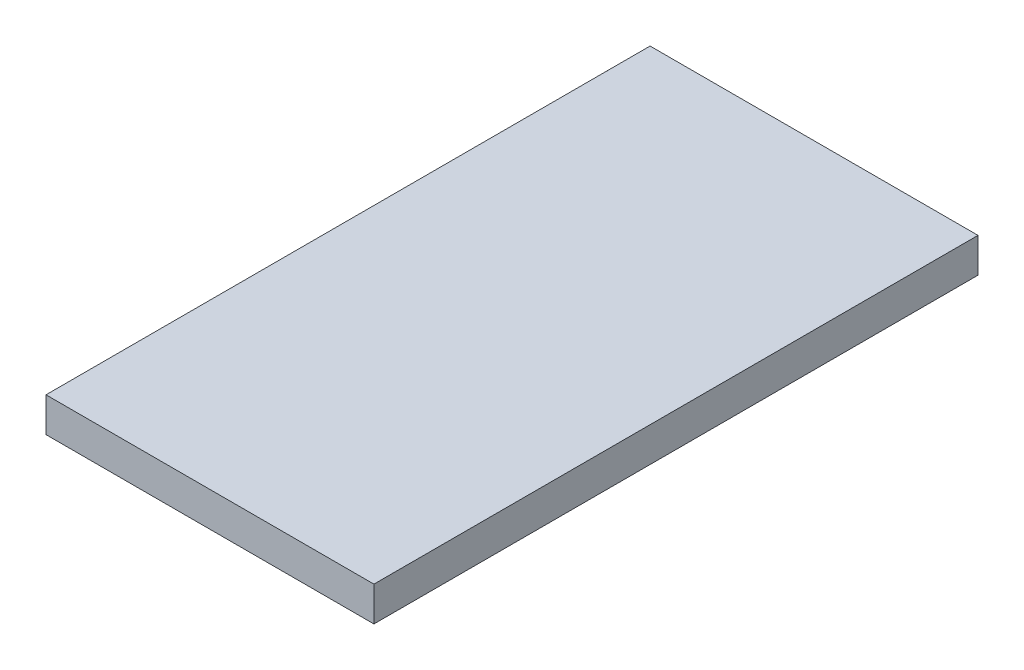
ISO-10303-21;
HEADER;
FILE_DESCRIPTION(('STEP AP214'),'2;1');
FILE_NAME('part.step','',(''),(''),'','','');
FILE_SCHEMA(('AUTOMOTIVE_DESIGN { 1 0 10303 214 1 1 1 1 }'));
ENDSEC;
DATA;
#1=APPLICATION_CONTEXT('core data for automotive mechanical design processes');
#2=APPLICATION_PROTOCOL_DEFINITION('international standard','automotive_design',2000,#1);
#3=PRODUCT_CONTEXT('',#1,'mechanical');
#4=PRODUCT('Part','Part','',(#3));
#5=PRODUCT_RELATED_PRODUCT_CATEGORY('part','',(#4));
#6=PRODUCT_DEFINITION_FORMATION('','',#4);
#7=PRODUCT_DEFINITION_CONTEXT('part definition',#1,'design');
#8=PRODUCT_DEFINITION('design','',#6,#7);
#9=PRODUCT_DEFINITION_SHAPE('','',#8);
#10=(LENGTH_UNIT() NAMED_UNIT(*) SI_UNIT(.MILLI.,.METRE.));
#11=(NAMED_UNIT(*) PLANE_ANGLE_UNIT() SI_UNIT($,.RADIAN.));
#12=(NAMED_UNIT(*) SI_UNIT($,.STERADIAN.) SOLID_ANGLE_UNIT());
#13=UNCERTAINTY_MEASURE_WITH_UNIT(LENGTH_MEASURE(1.E-05),#10,'distance_accuracy_value','');
#14=(GEOMETRIC_REPRESENTATION_CONTEXT(3) GLOBAL_UNCERTAINTY_ASSIGNED_CONTEXT((#13)) GLOBAL_UNIT_ASSIGNED_CONTEXT((#10,
#11,#12)) REPRESENTATION_CONTEXT('',''));
#15=CARTESIAN_POINT('',(0.,0.,0.));
#16=DIRECTION('',(0.,0.,1.));
#17=DIRECTION('',(1.,0.,0.));
#18=AXIS2_PLACEMENT_3D('',#15,#16,#17);
#19=CARTESIAN_POINT('',(0.,2.,17.5));
#20=DIRECTION('',(0.,0.,-1.));
#21=DIRECTION('',(-1.,0.,0.));
#22=AXIS2_PLACEMENT_3D('',#19,#20,#21);
#23=PLANE('',#22);
#24=DIRECTION('',(1.,0.,0.));
#25=VECTOR('',#24,1.);
#26=CARTESIAN_POINT('',(0.,0.,17.5));
#27=LINE('',#26,#25);
#28=CARTESIAN_POINT('',(-9.5,0.,17.5));
#29=VERTEX_POINT('',#28);
#30=CARTESIAN_POINT('',(9.5,0.,17.5));
#31=VERTEX_POINT('',#30);
#32=EDGE_CURVE('E102',#29,#31,#27,.T.);
#33=ORIENTED_EDGE('',*,*,#32,.T.);
#34=DIRECTION('',(0.,-1.,0.));
#35=VECTOR('',#34,1.);
#36=CARTESIAN_POINT('',(9.5,2.,17.5));
#37=LINE('',#36,#35);
#38=CARTESIAN_POINT('',(9.5,2.,17.5));
#39=VERTEX_POINT('',#38);
#40=EDGE_CURVE('E11',#39,#31,#37,.T.);
#41=ORIENTED_EDGE('',*,*,#40,.F.);
#42=DIRECTION('',(1.,0.,0.));
#43=VECTOR('',#42,1.);
#44=CARTESIAN_POINT('',(0.,2.,17.5));
#45=LINE('',#44,#43);
#46=CARTESIAN_POINT('',(-9.5,2.,17.5));
#47=VERTEX_POINT('',#46);
#48=EDGE_CURVE('E88',#47,#39,#45,.T.);
#49=ORIENTED_EDGE('',*,*,#48,.F.);
#50=DIRECTION('',(0.,-1.,0.));
#51=VECTOR('',#50,1.);
#52=CARTESIAN_POINT('',(-9.5,2.,17.5));
#53=LINE('',#52,#51);
#54=EDGE_CURVE('E55',#47,#29,#53,.T.);
#55=ORIENTED_EDGE('',*,*,#54,.T.);
#56=EDGE_LOOP('',(#33,#41,#49,#55));
#57=FACE_BOUND('',#56,.T.);
#58=ADVANCED_FACE('F39',(#57),#23,.F.);
#59=CARTESIAN_POINT('',(9.5,2.,0.));
#60=DIRECTION('',(-1.,0.,0.));
#61=DIRECTION('',(0.,0.,1.));
#62=AXIS2_PLACEMENT_3D('',#59,#60,#61);
#63=PLANE('',#62);
#64=DIRECTION('',(0.,0.,-1.));
#65=VECTOR('',#64,1.);
#66=CARTESIAN_POINT('',(9.5,0.,0.));
#67=LINE('',#66,#65);
#68=CARTESIAN_POINT('',(9.5,0.,-17.5));
#69=VERTEX_POINT('',#68);
#70=EDGE_CURVE('E93',#31,#69,#67,.T.);
#71=ORIENTED_EDGE('',*,*,#70,.T.);
#72=DIRECTION('',(0.,-1.,0.));
#73=VECTOR('',#72,1.);
#74=CARTESIAN_POINT('',(9.5,2.,-17.5));
#75=LINE('',#74,#73);
#76=CARTESIAN_POINT('',(9.5,2.,-17.5));
#77=VERTEX_POINT('',#76);
#78=EDGE_CURVE('E47',#77,#69,#75,.T.);
#79=ORIENTED_EDGE('',*,*,#78,.F.);
#80=DIRECTION('',(0.,0.,-1.));
#81=VECTOR('',#80,1.);
#82=CARTESIAN_POINT('',(9.5,2.,0.));
#83=LINE('',#82,#81);
#84=EDGE_CURVE('E80',#39,#77,#83,.T.);
#85=ORIENTED_EDGE('',*,*,#84,.F.);
#86=ORIENTED_EDGE('',*,*,#40,.T.);
#87=EDGE_LOOP('',(#71,#79,#85,#86));
#88=FACE_BOUND('',#87,.T.);
#89=ADVANCED_FACE('F92',(#88),#63,.F.);
#90=CARTESIAN_POINT('',(0.,2.,-17.5));
#91=DIRECTION('',(0.,0.,-1.));
#92=DIRECTION('',(-1.,0.,0.));
#93=AXIS2_PLACEMENT_3D('',#90,#91,#92);
#94=PLANE('',#93);
#95=DIRECTION('',(1.,0.,0.));
#96=VECTOR('',#95,1.);
#97=CARTESIAN_POINT('',(0.,0.,-17.5));
#98=LINE('',#97,#96);
#99=CARTESIAN_POINT('',(-9.5,0.,-17.5));
#100=VERTEX_POINT('',#99);
#101=EDGE_CURVE('E105',#100,#69,#98,.T.);
#102=ORIENTED_EDGE('',*,*,#101,.F.);
#103=DIRECTION('',(0.,-1.,0.));
#104=VECTOR('',#103,1.);
#105=CARTESIAN_POINT('',(-9.5,2.,-17.5));
#106=LINE('',#105,#104);
#107=CARTESIAN_POINT('',(-9.5,2.,-17.5));
#108=VERTEX_POINT('',#107);
#109=EDGE_CURVE('E69',#108,#100,#106,.T.);
#110=ORIENTED_EDGE('',*,*,#109,.F.);
#111=DIRECTION('',(1.,0.,0.));
#112=VECTOR('',#111,1.);
#113=CARTESIAN_POINT('',(0.,2.,-17.5));
#114=LINE('',#113,#112);
#115=EDGE_CURVE('E87',#108,#77,#114,.T.);
#116=ORIENTED_EDGE('',*,*,#115,.T.);
#117=ORIENTED_EDGE('',*,*,#78,.T.);
#118=EDGE_LOOP('',(#102,#110,#116,#117));
#119=FACE_BOUND('',#118,.T.);
#120=ADVANCED_FACE('F96',(#119),#94,.T.);
#121=CARTESIAN_POINT('',(-9.5,2.,0.));
#122=DIRECTION('',(-1.,0.,0.));
#123=DIRECTION('',(0.,0.,1.));
#124=AXIS2_PLACEMENT_3D('',#121,#122,#123);
#125=PLANE('',#124);
#126=DIRECTION('',(0.,0.,-1.));
#127=VECTOR('',#126,1.);
#128=CARTESIAN_POINT('',(-9.5,0.,0.));
#129=LINE('',#128,#127);
#130=EDGE_CURVE('E107',#29,#100,#129,.T.);
#131=ORIENTED_EDGE('',*,*,#130,.F.);
#132=ORIENTED_EDGE('',*,*,#54,.F.);
#133=DIRECTION('',(0.,0.,-1.));
#134=VECTOR('',#133,1.);
#135=CARTESIAN_POINT('',(-9.5,2.,0.));
#136=LINE('',#135,#134);
#137=EDGE_CURVE('E97',#47,#108,#136,.T.);
#138=ORIENTED_EDGE('',*,*,#137,.T.);
#139=ORIENTED_EDGE('',*,*,#109,.T.);
#140=EDGE_LOOP('',(#131,#132,#138,#139));
#141=FACE_BOUND('',#140,.T.);
#142=ADVANCED_FACE('F113',(#141),#125,.T.);
#143=CARTESIAN_POINT('',(0.,2.,0.));
#144=DIRECTION('',(0.,1.,0.));
#145=DIRECTION('',(0.,0.,1.));
#146=AXIS2_PLACEMENT_3D('',#143,#144,#145);
#147=PLANE('',#146);
#148=ORIENTED_EDGE('',*,*,#48,.T.);
#149=ORIENTED_EDGE('',*,*,#84,.T.);
#150=ORIENTED_EDGE('',*,*,#115,.F.);
#151=ORIENTED_EDGE('',*,*,#137,.F.);
#152=EDGE_LOOP('',(#148,#149,#150,#151));
#153=FACE_BOUND('',#152,.T.);
#154=ADVANCED_FACE('F84',(#153),#147,.T.);
#155=CARTESIAN_POINT('',(0.,0.,0.));
#156=DIRECTION('',(0.,1.,0.));
#157=DIRECTION('',(0.,0.,1.));
#158=AXIS2_PLACEMENT_3D('',#155,#156,#157);
#159=PLANE('',#158);
#160=ORIENTED_EDGE('',*,*,#32,.F.);
#161=ORIENTED_EDGE('',*,*,#130,.T.);
#162=ORIENTED_EDGE('',*,*,#101,.T.);
#163=ORIENTED_EDGE('',*,*,#70,.F.);
#164=EDGE_LOOP('',(#160,#161,#162,#163));
#165=FACE_BOUND('',#164,.T.);
#166=ADVANCED_FACE('F112',(#165),#159,.F.);
#167=CLOSED_SHELL('',(#58,#89,#120,#142,#154,#166));
#168=MANIFOLD_SOLID_BREP('B2',#167);
#169=ADVANCED_BREP_SHAPE_REPRESENTATION('',(#18,#168),#14);
#170=SHAPE_DEFINITION_REPRESENTATION(#9,#169);
ENDSEC;
END-ISO-10303-21;
